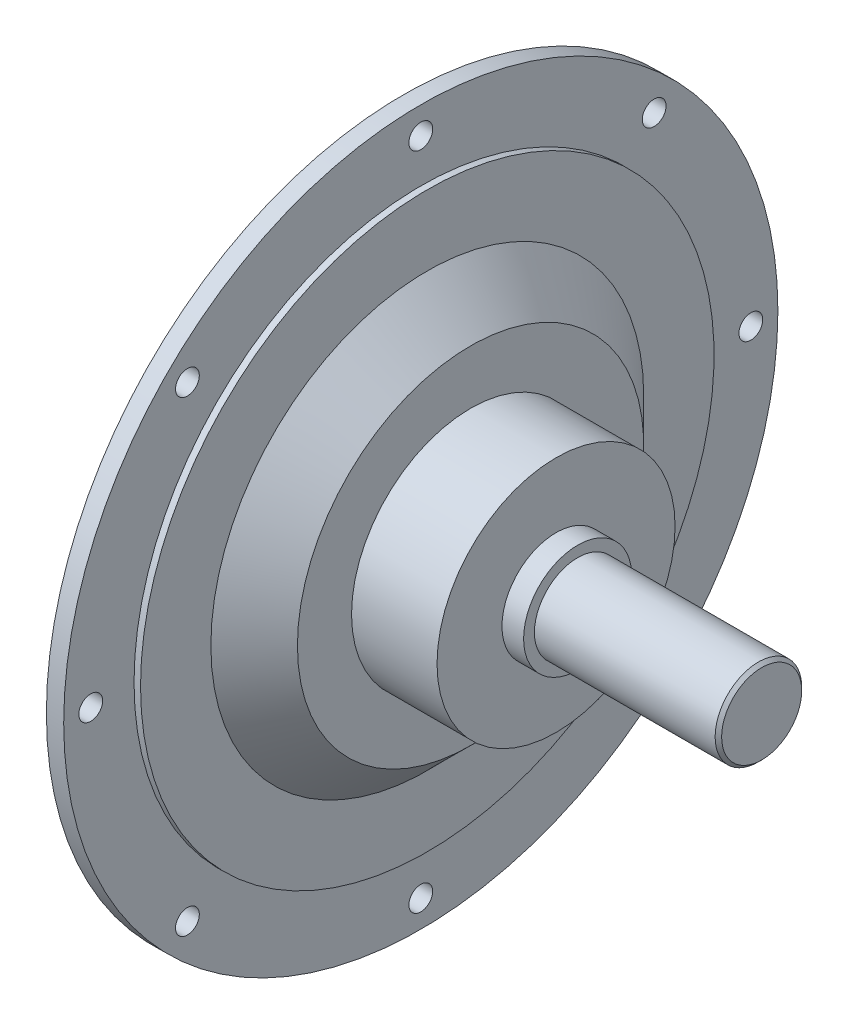
ISO-10303-21;
HEADER;
FILE_DESCRIPTION(('STEP AP214'),'2;1');
FILE_NAME('part.step','',(''),(''),'','','');
FILE_SCHEMA(('AUTOMOTIVE_DESIGN { 1 0 10303 214 1 1 1 1 }'));
ENDSEC;
DATA;
#1=APPLICATION_CONTEXT('core data for automotive mechanical design processes');
#2=APPLICATION_PROTOCOL_DEFINITION('international standard','automotive_design',2000,#1);
#3=PRODUCT_CONTEXT('',#1,'mechanical');
#4=PRODUCT('Part','Part','',(#3));
#5=PRODUCT_RELATED_PRODUCT_CATEGORY('part','',(#4));
#6=PRODUCT_DEFINITION_FORMATION('','',#4);
#7=PRODUCT_DEFINITION_CONTEXT('part definition',#1,'design');
#8=PRODUCT_DEFINITION('design','',#6,#7);
#9=PRODUCT_DEFINITION_SHAPE('','',#8);
#10=(LENGTH_UNIT() NAMED_UNIT(*) SI_UNIT(.MILLI.,.METRE.));
#11=(NAMED_UNIT(*) PLANE_ANGLE_UNIT() SI_UNIT($,.RADIAN.));
#12=(NAMED_UNIT(*) SI_UNIT($,.STERADIAN.) SOLID_ANGLE_UNIT());
#13=UNCERTAINTY_MEASURE_WITH_UNIT(LENGTH_MEASURE(1.E-05),#10,'distance_accuracy_value','');
#14=(GEOMETRIC_REPRESENTATION_CONTEXT(3) GLOBAL_UNCERTAINTY_ASSIGNED_CONTEXT((#13)) GLOBAL_UNIT_ASSIGNED_CONTEXT((#10,
#11,#12)) REPRESENTATION_CONTEXT('',''));
#15=CARTESIAN_POINT('',(0.,0.,0.));
#16=DIRECTION('',(0.,0.,1.));
#17=DIRECTION('',(1.,0.,0.));
#18=AXIS2_PLACEMENT_3D('',#15,#16,#17);
#19=CARTESIAN_POINT('',(0.,132.5,0.));
#20=DIRECTION('',(-1.,0.,0.));
#21=DIRECTION('',(0.,0.,1.));
#22=AXIS2_PLACEMENT_3D('',#19,#20,#21);
#23=PLANE('',#22);
#24=CARTESIAN_POINT('',(0.,107.83378413095,107.833784130947));
#25=DIRECTION('',(1.,0.,0.));
#26=DIRECTION('',(0.,0.,-1.));
#27=AXIS2_PLACEMENT_3D('',#24,#25,#26);
#28=CIRCLE('',#27,5.49999999999999);
#29=CARTESIAN_POINT('',(0.,107.83378413095,102.333784130947));
#30=VERTEX_POINT('',#29);
#31=EDGE_CURVE('E137',#30,#30,#28,.T.);
#32=ORIENTED_EDGE('',*,*,#31,.F.);
#33=EDGE_LOOP('',(#32));
#34=FACE_BOUND('',#33,.T.);
#35=CARTESIAN_POINT('',(0.,1.59735271252073E-12,152.5));
#36=DIRECTION('',(1.,0.,0.));
#37=DIRECTION('',(0.,0.,-1.));
#38=AXIS2_PLACEMENT_3D('',#35,#36,#37);
#39=CIRCLE('',#38,5.49999999999999);
#40=CARTESIAN_POINT('',(0.,1.59735271252073E-12,147.));
#41=VERTEX_POINT('',#40);
#42=EDGE_CURVE('E131',#41,#41,#39,.T.);
#43=ORIENTED_EDGE('',*,*,#42,.F.);
#44=EDGE_LOOP('',(#43));
#45=FACE_BOUND('',#44,.T.);
#46=CARTESIAN_POINT('',(0.,-107.833784130948,107.833784130949));
#47=DIRECTION('',(1.,0.,0.));
#48=DIRECTION('',(0.,0.,-1.));
#49=AXIS2_PLACEMENT_3D('',#46,#47,#48);
#50=CIRCLE('',#49,5.49999999999999);
#51=CARTESIAN_POINT('',(0.,-107.833784130948,102.333784130949));
#52=VERTEX_POINT('',#51);
#53=EDGE_CURVE('E125',#52,#52,#50,.T.);
#54=ORIENTED_EDGE('',*,*,#53,.F.);
#55=EDGE_LOOP('',(#54));
#56=FACE_BOUND('',#55,.T.);
#57=CARTESIAN_POINT('',(0.,-152.5,0.));
#58=DIRECTION('',(1.,0.,0.));
#59=DIRECTION('',(0.,0.,-1.));
#60=AXIS2_PLACEMENT_3D('',#57,#58,#59);
#61=CIRCLE('',#60,5.49999999999998);
#62=CARTESIAN_POINT('',(0.,-152.5,-5.49999999999998));
#63=VERTEX_POINT('',#62);
#64=EDGE_CURVE('E119',#63,#63,#61,.T.);
#65=ORIENTED_EDGE('',*,*,#64,.F.);
#66=EDGE_LOOP('',(#65));
#67=FACE_BOUND('',#66,.T.);
#68=CARTESIAN_POINT('',(0.,-107.833784130949,-107.833784130948));
#69=DIRECTION('',(1.,0.,0.));
#70=DIRECTION('',(0.,0.,-1.));
#71=AXIS2_PLACEMENT_3D('',#68,#69,#70);
#72=CIRCLE('',#71,5.49999999999999);
#73=CARTESIAN_POINT('',(0.,-107.833784130949,-113.333784130948));
#74=VERTEX_POINT('',#73);
#75=EDGE_CURVE('E113',#74,#74,#72,.T.);
#76=ORIENTED_EDGE('',*,*,#75,.F.);
#77=EDGE_LOOP('',(#76));
#78=FACE_BOUND('',#77,.T.);
#79=CARTESIAN_POINT('',(0.,-5.32450904173578E-13,-152.5));
#80=DIRECTION('',(1.,0.,0.));
#81=DIRECTION('',(0.,0.,-1.));
#82=AXIS2_PLACEMENT_3D('',#79,#80,#81);
#83=CIRCLE('',#82,5.49999999999999);
#84=CARTESIAN_POINT('',(0.,-5.32450904173578E-13,-158.));
#85=VERTEX_POINT('',#84);
#86=EDGE_CURVE('E107',#85,#85,#83,.T.);
#87=ORIENTED_EDGE('',*,*,#86,.F.);
#88=EDGE_LOOP('',(#87));
#89=FACE_BOUND('',#88,.T.);
#90=CARTESIAN_POINT('',(0.,107.833784130948,-107.833784130949));
#91=DIRECTION('',(1.,0.,0.));
#92=DIRECTION('',(0.,0.,-1.));
#93=AXIS2_PLACEMENT_3D('',#90,#91,#92);
#94=CIRCLE('',#93,5.49999999999999);
#95=CARTESIAN_POINT('',(0.,107.833784130948,-113.333784130949));
#96=VERTEX_POINT('',#95);
#97=EDGE_CURVE('E101',#96,#96,#94,.T.);
#98=ORIENTED_EDGE('',*,*,#97,.F.);
#99=EDGE_LOOP('',(#98));
#100=FACE_BOUND('',#99,.T.);
#101=CARTESIAN_POINT('',(0.,0.,0.));
#102=DIRECTION('',(-1.,0.,0.));
#103=DIRECTION('',(0.,0.,1.));
#104=AXIS2_PLACEMENT_3D('',#101,#102,#103);
#105=CIRCLE('',#104,132.5);
#106=CARTESIAN_POINT('',(0.,0.,132.5));
#107=VERTEX_POINT('',#106);
#108=EDGE_CURVE('E89',#107,#107,#105,.T.);
#109=ORIENTED_EDGE('',*,*,#108,.T.);
#110=EDGE_LOOP('',(#109));
#111=FACE_BOUND('',#110,.T.);
#112=CARTESIAN_POINT('',(0.,0.,0.));
#113=DIRECTION('',(-1.,0.,0.));
#114=DIRECTION('',(0.,0.,1.));
#115=AXIS2_PLACEMENT_3D('',#112,#113,#114);
#116=CIRCLE('',#115,165.);
#117=CARTESIAN_POINT('',(0.,0.,165.));
#118=VERTEX_POINT('',#117);
#119=EDGE_CURVE('E86',#118,#118,#116,.T.);
#120=ORIENTED_EDGE('',*,*,#119,.F.);
#121=EDGE_LOOP('',(#120));
#122=FACE_BOUND('',#121,.T.);
#123=CARTESIAN_POINT('',(0.,152.5,0.));
#124=DIRECTION('',(1.,0.,0.));
#125=DIRECTION('',(0.,0.,-1.));
#126=AXIS2_PLACEMENT_3D('',#123,#124,#125);
#127=CIRCLE('',#126,5.49999999999998);
#128=CARTESIAN_POINT('',(0.,152.5,-5.49999999999998));
#129=VERTEX_POINT('',#128);
#130=EDGE_CURVE('E95',#129,#129,#127,.T.);
#131=ORIENTED_EDGE('',*,*,#130,.F.);
#132=EDGE_LOOP('',(#131));
#133=FACE_BOUND('',#132,.T.);
#134=ADVANCED_FACE('F33',(#34,#45,#56,#67,#78,#89,#100,#111,#122,#133),#23,.F.);
#135=CARTESIAN_POINT('',(-57.6549737634885,0.,0.));
#136=DIRECTION('',(-1.,0.,0.));
#137=DIRECTION('',(0.,0.,1.));
#138=AXIS2_PLACEMENT_3D('',#135,#136,#137);
#139=CYLINDRICAL_SURFACE('',#138,132.5);
#140=ORIENTED_EDGE('',*,*,#108,.F.);
#141=EDGE_LOOP('',(#140));
#142=FACE_BOUND('',#141,.T.);
#143=CARTESIAN_POINT('',(3.,0.,0.));
#144=DIRECTION('',(-1.,0.,0.));
#145=DIRECTION('',(0.,0.,1.));
#146=AXIS2_PLACEMENT_3D('',#143,#144,#145);
#147=CIRCLE('',#146,132.5);
#148=CARTESIAN_POINT('',(3.,0.,132.5));
#149=VERTEX_POINT('',#148);
#150=EDGE_CURVE('E44',#149,#149,#147,.T.);
#151=ORIENTED_EDGE('',*,*,#150,.T.);
#152=EDGE_LOOP('',(#151));
#153=FACE_BOUND('',#152,.T.);
#154=ADVANCED_FACE('F145',(#142,#153),#139,.T.);
#155=CARTESIAN_POINT('',(3.,132.5,0.));
#156=DIRECTION('',(-1.,0.,0.));
#157=DIRECTION('',(0.,0.,1.));
#158=AXIS2_PLACEMENT_3D('',#155,#156,#157);
#159=PLANE('',#158);
#160=ORIENTED_EDGE('',*,*,#150,.F.);
#161=EDGE_LOOP('',(#160));
#162=FACE_BOUND('',#161,.T.);
#163=CARTESIAN_POINT('',(3.,0.,0.));
#164=DIRECTION('',(-1.,0.,0.));
#165=DIRECTION('',(0.,0.,1.));
#166=AXIS2_PLACEMENT_3D('',#163,#164,#165);
#167=CIRCLE('',#166,99.9999999999999);
#168=CARTESIAN_POINT('',(3.,0.,99.9999999999999));
#169=VERTEX_POINT('',#168);
#170=EDGE_CURVE('E48',#169,#169,#167,.T.);
#171=ORIENTED_EDGE('',*,*,#170,.T.);
#172=EDGE_LOOP('',(#171));
#173=FACE_BOUND('',#172,.T.);
#174=ADVANCED_FACE('F234',(#162,#173),#159,.F.);
#175=CARTESIAN_POINT('',(23.,0.,0.));
#176=DIRECTION('',(-1.,0.,0.));
#177=DIRECTION('',(0.,0.,1.));
#178=AXIS2_PLACEMENT_3D('',#175,#176,#177);
#179=CONICAL_SURFACE('',#178,80.,0.785398163397446);
#180=ORIENTED_EDGE('',*,*,#170,.F.);
#181=EDGE_LOOP('',(#180));
#182=FACE_BOUND('',#181,.T.);
#183=CARTESIAN_POINT('',(23.,0.,0.));
#184=DIRECTION('',(-1.,0.,0.));
#185=DIRECTION('',(0.,0.,1.));
#186=AXIS2_PLACEMENT_3D('',#183,#184,#185);
#187=CIRCLE('',#186,80.);
#188=CARTESIAN_POINT('',(23.,0.,80.));
#189=VERTEX_POINT('',#188);
#190=EDGE_CURVE('E53',#189,#189,#187,.T.);
#191=ORIENTED_EDGE('',*,*,#190,.T.);
#192=EDGE_LOOP('',(#191));
#193=FACE_BOUND('',#192,.T.);
#194=ADVANCED_FACE('F230',(#182,#193),#179,.T.);
#195=CARTESIAN_POINT('',(23.,80.,0.));
#196=DIRECTION('',(-1.,0.,0.));
#197=DIRECTION('',(0.,0.,1.));
#198=AXIS2_PLACEMENT_3D('',#195,#196,#197);
#199=PLANE('',#198);
#200=ORIENTED_EDGE('',*,*,#190,.F.);
#201=EDGE_LOOP('',(#200));
#202=FACE_BOUND('',#201,.T.);
#203=CARTESIAN_POINT('',(23.,0.,0.));
#204=DIRECTION('',(-1.,0.,0.));
#205=DIRECTION('',(0.,0.,1.));
#206=AXIS2_PLACEMENT_3D('',#203,#204,#205);
#207=CIRCLE('',#206,55.);
#208=CARTESIAN_POINT('',(23.,0.,55.));
#209=VERTEX_POINT('',#208);
#210=EDGE_CURVE('E56',#209,#209,#207,.T.);
#211=ORIENTED_EDGE('',*,*,#210,.T.);
#212=EDGE_LOOP('',(#211));
#213=FACE_BOUND('',#212,.T.);
#214=ADVANCED_FACE('F226',(#202,#213),#199,.F.);
#215=CARTESIAN_POINT('',(-57.6549737634885,0.,0.));
#216=DIRECTION('',(-1.,0.,0.));
#217=DIRECTION('',(0.,0.,1.));
#218=AXIS2_PLACEMENT_3D('',#215,#216,#217);
#219=CYLINDRICAL_SURFACE('',#218,55.);
#220=ORIENTED_EDGE('',*,*,#210,.F.);
#221=EDGE_LOOP('',(#220));
#222=FACE_BOUND('',#221,.T.);
#223=CARTESIAN_POINT('',(62.5,0.,0.));
#224=DIRECTION('',(-1.,0.,0.));
#225=DIRECTION('',(0.,0.,1.));
#226=AXIS2_PLACEMENT_3D('',#223,#224,#225);
#227=CIRCLE('',#226,55.);
#228=CARTESIAN_POINT('',(62.5,0.,55.));
#229=VERTEX_POINT('',#228);
#230=EDGE_CURVE('E59',#229,#229,#227,.T.);
#231=ORIENTED_EDGE('',*,*,#230,.T.);
#232=EDGE_LOOP('',(#231));
#233=FACE_BOUND('',#232,.T.);
#234=ADVANCED_FACE('F222',(#222,#233),#219,.T.);
#235=CARTESIAN_POINT('',(62.5,55.,0.));
#236=DIRECTION('',(-1.,0.,0.));
#237=DIRECTION('',(0.,0.,1.));
#238=AXIS2_PLACEMENT_3D('',#235,#236,#237);
#239=PLANE('',#238);
#240=ORIENTED_EDGE('',*,*,#230,.F.);
#241=EDGE_LOOP('',(#240));
#242=FACE_BOUND('',#241,.T.);
#243=CARTESIAN_POINT('',(62.5,0.,0.));
#244=DIRECTION('',(-1.,0.,0.));
#245=DIRECTION('',(0.,0.,1.));
#246=AXIS2_PLACEMENT_3D('',#243,#244,#245);
#247=CIRCLE('',#246,25.);
#248=CARTESIAN_POINT('',(62.5,0.,25.));
#249=VERTEX_POINT('',#248);
#250=EDGE_CURVE('E62',#249,#249,#247,.T.);
#251=ORIENTED_EDGE('',*,*,#250,.T.);
#252=EDGE_LOOP('',(#251));
#253=FACE_BOUND('',#252,.T.);
#254=ADVANCED_FACE('F218',(#242,#253),#239,.F.);
#255=CARTESIAN_POINT('',(-57.6549737634885,0.,0.));
#256=DIRECTION('',(-1.,0.,0.));
#257=DIRECTION('',(0.,0.,1.));
#258=AXIS2_PLACEMENT_3D('',#255,#256,#257);
#259=CYLINDRICAL_SURFACE('',#258,25.);
#260=ORIENTED_EDGE('',*,*,#250,.F.);
#261=EDGE_LOOP('',(#260));
#262=FACE_BOUND('',#261,.T.);
#263=CARTESIAN_POINT('',(72.5,0.,0.));
#264=DIRECTION('',(-1.,0.,0.));
#265=DIRECTION('',(0.,0.,1.));
#266=AXIS2_PLACEMENT_3D('',#263,#264,#265);
#267=CIRCLE('',#266,25.);
#268=CARTESIAN_POINT('',(72.5,0.,25.));
#269=VERTEX_POINT('',#268);
#270=EDGE_CURVE('E65',#269,#269,#267,.T.);
#271=ORIENTED_EDGE('',*,*,#270,.T.);
#272=EDGE_LOOP('',(#271));
#273=FACE_BOUND('',#272,.T.);
#274=ADVANCED_FACE('F214',(#262,#273),#259,.T.);
#275=CARTESIAN_POINT('',(72.5,25.,0.));
#276=DIRECTION('',(-1.,0.,0.));
#277=DIRECTION('',(0.,0.,1.));
#278=AXIS2_PLACEMENT_3D('',#275,#276,#277);
#279=PLANE('',#278);
#280=ORIENTED_EDGE('',*,*,#270,.F.);
#281=EDGE_LOOP('',(#280));
#282=FACE_BOUND('',#281,.T.);
#283=CARTESIAN_POINT('',(72.5,0.,0.));
#284=DIRECTION('',(-1.,0.,0.));
#285=DIRECTION('',(0.,0.,1.));
#286=AXIS2_PLACEMENT_3D('',#283,#284,#285);
#287=CIRCLE('',#286,20.);
#288=CARTESIAN_POINT('',(72.5,0.,20.));
#289=VERTEX_POINT('',#288);
#290=EDGE_CURVE('E68',#289,#289,#287,.T.);
#291=ORIENTED_EDGE('',*,*,#290,.T.);
#292=EDGE_LOOP('',(#291));
#293=FACE_BOUND('',#292,.T.);
#294=ADVANCED_FACE('F211',(#282,#293),#279,.F.);
#295=CARTESIAN_POINT('',(-57.6549737634885,0.,0.));
#296=DIRECTION('',(-1.,0.,0.));
#297=DIRECTION('',(0.,0.,1.));
#298=AXIS2_PLACEMENT_3D('',#295,#296,#297);
#299=CYLINDRICAL_SURFACE('',#298,20.);
#300=CARTESIAN_POINT('',(156.,0.,0.));
#301=DIRECTION('',(-1.,0.,0.));
#302=DIRECTION('',(0.,0.,1.));
#303=AXIS2_PLACEMENT_3D('',#300,#301,#302);
#304=CIRCLE('',#303,20.);
#305=CARTESIAN_POINT('',(156.,0.,20.));
#306=VERTEX_POINT('',#305);
#307=EDGE_CURVE('E40',#306,#306,#304,.T.);
#308=ORIENTED_EDGE('',*,*,#307,.T.);
#309=EDGE_LOOP('',(#308));
#310=FACE_BOUND('',#309,.T.);
#311=ORIENTED_EDGE('',*,*,#290,.F.);
#312=EDGE_LOOP('',(#311));
#313=FACE_BOUND('',#312,.T.);
#314=ADVANCED_FACE('F208',(#310,#313),#299,.T.);
#315=CARTESIAN_POINT('',(157.5,20.,0.));
#316=DIRECTION('',(-1.,0.,0.));
#317=DIRECTION('',(0.,0.,1.));
#318=AXIS2_PLACEMENT_3D('',#315,#316,#317);
#319=PLANE('',#318);
#320=CARTESIAN_POINT('',(157.5,0.,0.));
#321=DIRECTION('',(-1.,0.,0.));
#322=DIRECTION('',(0.,0.,1.));
#323=AXIS2_PLACEMENT_3D('',#320,#321,#322);
#324=CIRCLE('',#323,18.5);
#325=CARTESIAN_POINT('',(157.5,0.,18.5));
#326=VERTEX_POINT('',#325);
#327=EDGE_CURVE('E10',#326,#326,#324,.F.);
#328=ORIENTED_EDGE('',*,*,#327,.T.);
#329=EDGE_LOOP('',(#328));
#330=FACE_BOUND('',#329,.T.);
#331=ADVANCED_FACE('F204',(#330),#319,.F.);
#332=CARTESIAN_POINT('',(-40.,0.,0.));
#333=DIRECTION('',(1.,0.,0.));
#334=DIRECTION('',(0.,0.,-1.));
#335=AXIS2_PLACEMENT_3D('',#332,#333,#334);
#336=PLANE('',#335);
#337=CARTESIAN_POINT('',(-40.,0.,0.));
#338=DIRECTION('',(-1.,0.,0.));
#339=DIRECTION('',(0.,0.,1.));
#340=AXIS2_PLACEMENT_3D('',#337,#338,#339);
#341=CIRCLE('',#340,55.);
#342=CARTESIAN_POINT('',(-40.,0.,55.));
#343=VERTEX_POINT('',#342);
#344=EDGE_CURVE('E71',#343,#343,#341,.T.);
#345=ORIENTED_EDGE('',*,*,#344,.T.);
#346=EDGE_LOOP('',(#345));
#347=FACE_BOUND('',#346,.T.);
#348=ADVANCED_FACE('F200',(#347),#336,.F.);
#349=CARTESIAN_POINT('',(12.,0.,0.));
#350=DIRECTION('',(1.,0.,0.));
#351=DIRECTION('',(0.,0.,-1.));
#352=AXIS2_PLACEMENT_3D('',#349,#350,#351);
#353=CONICAL_SURFACE('',#352,68.9333580064182,0.261799387799146);
#354=ORIENTED_EDGE('',*,*,#344,.F.);
#355=EDGE_LOOP('',(#354));
#356=FACE_BOUND('',#355,.T.);
#357=CARTESIAN_POINT('',(12.,0.,0.));
#358=DIRECTION('',(-1.,0.,0.));
#359=DIRECTION('',(0.,0.,1.));
#360=AXIS2_PLACEMENT_3D('',#357,#358,#359);
#361=CIRCLE('',#360,68.9333580064182);
#362=CARTESIAN_POINT('',(12.,0.,68.9333580064182));
#363=VERTEX_POINT('',#362);
#364=EDGE_CURVE('E74',#363,#363,#361,.T.);
#365=ORIENTED_EDGE('',*,*,#364,.T.);
#366=EDGE_LOOP('',(#365));
#367=FACE_BOUND('',#366,.T.);
#368=ADVANCED_FACE('F196',(#356,#367),#353,.T.);
#369=CARTESIAN_POINT('',(12.,75.443650813896,0.));
#370=DIRECTION('',(1.,0.,0.));
#371=DIRECTION('',(0.,0.,-1.));
#372=AXIS2_PLACEMENT_3D('',#369,#370,#371);
#373=PLANE('',#372);
#374=ORIENTED_EDGE('',*,*,#364,.F.);
#375=EDGE_LOOP('',(#374));
#376=FACE_BOUND('',#375,.T.);
#377=CARTESIAN_POINT('',(12.,0.,0.));
#378=DIRECTION('',(-1.,0.,0.));
#379=DIRECTION('',(0.,0.,1.));
#380=AXIS2_PLACEMENT_3D('',#377,#378,#379);
#381=CIRCLE('',#380,75.443650813896);
#382=CARTESIAN_POINT('',(12.,0.,75.443650813896));
#383=VERTEX_POINT('',#382);
#384=EDGE_CURVE('E77',#383,#383,#381,.T.);
#385=ORIENTED_EDGE('',*,*,#384,.T.);
#386=EDGE_LOOP('',(#385));
#387=FACE_BOUND('',#386,.T.);
#388=ADVANCED_FACE('F192',(#376,#387),#373,.F.);
#389=CARTESIAN_POINT('',(-7.99999999999999,0.,0.));
#390=DIRECTION('',(-1.,0.,0.));
#391=DIRECTION('',(0.,0.,1.));
#392=AXIS2_PLACEMENT_3D('',#389,#390,#391);
#393=CONICAL_SURFACE('',#392,95.4436508138959,0.785398163397446);
#394=ORIENTED_EDGE('',*,*,#384,.F.);
#395=EDGE_LOOP('',(#394));
#396=FACE_BOUND('',#395,.T.);
#397=CARTESIAN_POINT('',(-7.99999999999999,0.,0.));
#398=DIRECTION('',(-1.,0.,0.));
#399=DIRECTION('',(0.,0.,1.));
#400=AXIS2_PLACEMENT_3D('',#397,#398,#399);
#401=CIRCLE('',#400,95.4436508138959);
#402=CARTESIAN_POINT('',(-7.99999999999999,0.,95.4436508138959));
#403=VERTEX_POINT('',#402);
#404=EDGE_CURVE('E80',#403,#403,#401,.T.);
#405=ORIENTED_EDGE('',*,*,#404,.T.);
#406=EDGE_LOOP('',(#405));
#407=FACE_BOUND('',#406,.T.);
#408=ADVANCED_FACE('F188',(#396,#407),#393,.F.);
#409=CARTESIAN_POINT('',(-8.,165.,0.));
#410=DIRECTION('',(1.,0.,0.));
#411=DIRECTION('',(0.,0.,-1.));
#412=AXIS2_PLACEMENT_3D('',#409,#410,#411);
#413=PLANE('',#412);
#414=CARTESIAN_POINT('',(-8.,107.83378413095,107.833784130947));
#415=DIRECTION('',(1.,0.,0.));
#416=DIRECTION('',(0.,0.,-1.));
#417=AXIS2_PLACEMENT_3D('',#414,#415,#416);
#418=CIRCLE('',#417,5.49999999999999);
#419=CARTESIAN_POINT('',(-8.,107.83378413095,102.333784130947));
#420=VERTEX_POINT('',#419);
#421=EDGE_CURVE('E134',#420,#420,#418,.T.);
#422=ORIENTED_EDGE('',*,*,#421,.T.);
#423=EDGE_LOOP('',(#422));
#424=FACE_BOUND('',#423,.T.);
#425=CARTESIAN_POINT('',(-8.,1.59735271252073E-12,152.5));
#426=DIRECTION('',(1.,0.,0.));
#427=DIRECTION('',(0.,0.,-1.));
#428=AXIS2_PLACEMENT_3D('',#425,#426,#427);
#429=CIRCLE('',#428,5.49999999999999);
#430=CARTESIAN_POINT('',(-8.,1.59735271252073E-12,147.));
#431=VERTEX_POINT('',#430);
#432=EDGE_CURVE('E128',#431,#431,#429,.T.);
#433=ORIENTED_EDGE('',*,*,#432,.T.);
#434=EDGE_LOOP('',(#433));
#435=FACE_BOUND('',#434,.T.);
#436=CARTESIAN_POINT('',(-8.,-107.833784130948,107.833784130949));
#437=DIRECTION('',(1.,0.,0.));
#438=DIRECTION('',(0.,0.,-1.));
#439=AXIS2_PLACEMENT_3D('',#436,#437,#438);
#440=CIRCLE('',#439,5.49999999999999);
#441=CARTESIAN_POINT('',(-8.,-107.833784130948,102.333784130949));
#442=VERTEX_POINT('',#441);
#443=EDGE_CURVE('E122',#442,#442,#440,.T.);
#444=ORIENTED_EDGE('',*,*,#443,.T.);
#445=EDGE_LOOP('',(#444));
#446=FACE_BOUND('',#445,.T.);
#447=CARTESIAN_POINT('',(-8.,-152.5,0.));
#448=DIRECTION('',(1.,0.,0.));
#449=DIRECTION('',(0.,0.,-1.));
#450=AXIS2_PLACEMENT_3D('',#447,#448,#449);
#451=CIRCLE('',#450,5.49999999999999);
#452=CARTESIAN_POINT('',(-8.,-152.5,-5.49999999999999));
#453=VERTEX_POINT('',#452);
#454=EDGE_CURVE('E116',#453,#453,#451,.T.);
#455=ORIENTED_EDGE('',*,*,#454,.T.);
#456=EDGE_LOOP('',(#455));
#457=FACE_BOUND('',#456,.T.);
#458=CARTESIAN_POINT('',(-8.,-107.833784130949,-107.833784130948));
#459=DIRECTION('',(1.,0.,0.));
#460=DIRECTION('',(0.,0.,-1.));
#461=AXIS2_PLACEMENT_3D('',#458,#459,#460);
#462=CIRCLE('',#461,5.49999999999999);
#463=CARTESIAN_POINT('',(-8.,-107.833784130949,-113.333784130948));
#464=VERTEX_POINT('',#463);
#465=EDGE_CURVE('E110',#464,#464,#462,.T.);
#466=ORIENTED_EDGE('',*,*,#465,.T.);
#467=EDGE_LOOP('',(#466));
#468=FACE_BOUND('',#467,.T.);
#469=CARTESIAN_POINT('',(-8.,-5.32450904173578E-13,-152.5));
#470=DIRECTION('',(1.,0.,0.));
#471=DIRECTION('',(0.,0.,-1.));
#472=AXIS2_PLACEMENT_3D('',#469,#470,#471);
#473=CIRCLE('',#472,5.49999999999999);
#474=CARTESIAN_POINT('',(-8.,-5.32450904173578E-13,-158.));
#475=VERTEX_POINT('',#474);
#476=EDGE_CURVE('E104',#475,#475,#473,.T.);
#477=ORIENTED_EDGE('',*,*,#476,.T.);
#478=EDGE_LOOP('',(#477));
#479=FACE_BOUND('',#478,.T.);
#480=CARTESIAN_POINT('',(-8.,107.833784130948,-107.833784130949));
#481=DIRECTION('',(1.,0.,0.));
#482=DIRECTION('',(0.,0.,-1.));
#483=AXIS2_PLACEMENT_3D('',#480,#481,#482);
#484=CIRCLE('',#483,5.49999999999999);
#485=CARTESIAN_POINT('',(-8.,107.833784130948,-113.333784130949));
#486=VERTEX_POINT('',#485);
#487=EDGE_CURVE('E98',#486,#486,#484,.T.);
#488=ORIENTED_EDGE('',*,*,#487,.T.);
#489=EDGE_LOOP('',(#488));
#490=FACE_BOUND('',#489,.T.);
#491=CARTESIAN_POINT('',(-8.,152.5,0.));
#492=DIRECTION('',(1.,0.,0.));
#493=DIRECTION('',(0.,0.,-1.));
#494=AXIS2_PLACEMENT_3D('',#491,#492,#493);
#495=CIRCLE('',#494,5.49999999999999);
#496=CARTESIAN_POINT('',(-8.,152.5,-5.49999999999999));
#497=VERTEX_POINT('',#496);
#498=EDGE_CURVE('E92',#497,#497,#495,.T.);
#499=ORIENTED_EDGE('',*,*,#498,.T.);
#500=EDGE_LOOP('',(#499));
#501=FACE_BOUND('',#500,.T.);
#502=ORIENTED_EDGE('',*,*,#404,.F.);
#503=EDGE_LOOP('',(#502));
#504=FACE_BOUND('',#503,.T.);
#505=CARTESIAN_POINT('',(-8.,0.,0.));
#506=DIRECTION('',(-1.,0.,0.));
#507=DIRECTION('',(0.,0.,1.));
#508=AXIS2_PLACEMENT_3D('',#505,#506,#507);
#509=CIRCLE('',#508,165.);
#510=CARTESIAN_POINT('',(-8.,0.,165.));
#511=VERTEX_POINT('',#510);
#512=EDGE_CURVE('E83',#511,#511,#509,.T.);
#513=ORIENTED_EDGE('',*,*,#512,.T.);
#514=EDGE_LOOP('',(#513));
#515=FACE_BOUND('',#514,.T.);
#516=ADVANCED_FACE('F184',(#424,#435,#446,#457,#468,#479,#490,#501,#504,#515),#413,.F.);
#517=CARTESIAN_POINT('',(-57.6549737634885,0.,0.));
#518=DIRECTION('',(-1.,0.,0.));
#519=DIRECTION('',(0.,0.,1.));
#520=AXIS2_PLACEMENT_3D('',#517,#518,#519);
#521=CYLINDRICAL_SURFACE('',#520,165.);
#522=ORIENTED_EDGE('',*,*,#512,.F.);
#523=EDGE_LOOP('',(#522));
#524=FACE_BOUND('',#523,.T.);
#525=ORIENTED_EDGE('',*,*,#119,.T.);
#526=EDGE_LOOP('',(#525));
#527=FACE_BOUND('',#526,.T.);
#528=ADVANCED_FACE('F177',(#524,#527),#521,.T.);
#529=CARTESIAN_POINT('',(156.,0.,0.));
#530=DIRECTION('',(-1.,0.,0.));
#531=DIRECTION('',(0.,0.,1.));
#532=AXIS2_PLACEMENT_3D('',#529,#530,#531);
#533=CONICAL_SURFACE('',#532,20.,0.785398163397443);
#534=ORIENTED_EDGE('',*,*,#327,.F.);
#535=EDGE_LOOP('',(#534));
#536=FACE_BOUND('',#535,.T.);
#537=ORIENTED_EDGE('',*,*,#307,.F.);
#538=EDGE_LOOP('',(#537));
#539=FACE_BOUND('',#538,.T.);
#540=ADVANCED_FACE('F35',(#536,#539),#533,.T.);
#541=CARTESIAN_POINT('',(0.,152.5,0.));
#542=DIRECTION('',(1.,0.,0.));
#543=DIRECTION('',(0.,0.,-1.));
#544=AXIS2_PLACEMENT_3D('',#541,#542,#543);
#545=CYLINDRICAL_SURFACE('',#544,5.49999999999999);
#546=ORIENTED_EDGE('',*,*,#498,.F.);
#547=EDGE_LOOP('',(#546));
#548=FACE_BOUND('',#547,.T.);
#549=ORIENTED_EDGE('',*,*,#130,.T.);
#550=EDGE_LOOP('',(#549));
#551=FACE_BOUND('',#550,.T.);
#552=ADVANCED_FACE('F165',(#548,#551),#545,.F.);
#553=CARTESIAN_POINT('',(0.,107.833784130948,-107.833784130949));
#554=DIRECTION('',(1.,0.,0.));
#555=DIRECTION('',(0.,0.,-1.));
#556=AXIS2_PLACEMENT_3D('',#553,#554,#555);
#557=CYLINDRICAL_SURFACE('',#556,5.49999999999999);
#558=ORIENTED_EDGE('',*,*,#487,.F.);
#559=EDGE_LOOP('',(#558));
#560=FACE_BOUND('',#559,.T.);
#561=ORIENTED_EDGE('',*,*,#97,.T.);
#562=EDGE_LOOP('',(#561));
#563=FACE_BOUND('',#562,.T.);
#564=ADVANCED_FACE('F167',(#560,#563),#557,.F.);
#565=CARTESIAN_POINT('',(0.,-5.32450904173578E-13,-152.5));
#566=DIRECTION('',(1.,0.,0.));
#567=DIRECTION('',(0.,0.,-1.));
#568=AXIS2_PLACEMENT_3D('',#565,#566,#567);
#569=CYLINDRICAL_SURFACE('',#568,5.49999999999999);
#570=ORIENTED_EDGE('',*,*,#476,.F.);
#571=EDGE_LOOP('',(#570));
#572=FACE_BOUND('',#571,.T.);
#573=ORIENTED_EDGE('',*,*,#86,.T.);
#574=EDGE_LOOP('',(#573));
#575=FACE_BOUND('',#574,.T.);
#576=ADVANCED_FACE('F174',(#572,#575),#569,.F.);
#577=CARTESIAN_POINT('',(0.,-107.833784130949,-107.833784130948));
#578=DIRECTION('',(1.,0.,0.));
#579=DIRECTION('',(0.,0.,-1.));
#580=AXIS2_PLACEMENT_3D('',#577,#578,#579);
#581=CYLINDRICAL_SURFACE('',#580,5.49999999999999);
#582=ORIENTED_EDGE('',*,*,#465,.F.);
#583=EDGE_LOOP('',(#582));
#584=FACE_BOUND('',#583,.T.);
#585=ORIENTED_EDGE('',*,*,#75,.T.);
#586=EDGE_LOOP('',(#585));
#587=FACE_BOUND('',#586,.T.);
#588=ADVANCED_FACE('F348',(#584,#587),#581,.F.);
#589=CARTESIAN_POINT('',(0.,-152.5,0.));
#590=DIRECTION('',(1.,0.,0.));
#591=DIRECTION('',(0.,0.,-1.));
#592=AXIS2_PLACEMENT_3D('',#589,#590,#591);
#593=CYLINDRICAL_SURFACE('',#592,5.49999999999999);
#594=ORIENTED_EDGE('',*,*,#454,.F.);
#595=EDGE_LOOP('',(#594));
#596=FACE_BOUND('',#595,.T.);
#597=ORIENTED_EDGE('',*,*,#64,.T.);
#598=EDGE_LOOP('',(#597));
#599=FACE_BOUND('',#598,.T.);
#600=ADVANCED_FACE('F356',(#596,#599),#593,.F.);
#601=CARTESIAN_POINT('',(0.,-107.833784130948,107.833784130949));
#602=DIRECTION('',(1.,0.,0.));
#603=DIRECTION('',(0.,0.,-1.));
#604=AXIS2_PLACEMENT_3D('',#601,#602,#603);
#605=CYLINDRICAL_SURFACE('',#604,5.49999999999999);
#606=ORIENTED_EDGE('',*,*,#443,.F.);
#607=EDGE_LOOP('',(#606));
#608=FACE_BOUND('',#607,.T.);
#609=ORIENTED_EDGE('',*,*,#53,.T.);
#610=EDGE_LOOP('',(#609));
#611=FACE_BOUND('',#610,.T.);
#612=ADVANCED_FACE('F365',(#608,#611),#605,.F.);
#613=CARTESIAN_POINT('',(0.,1.59735271252073E-12,152.5));
#614=DIRECTION('',(1.,0.,0.));
#615=DIRECTION('',(0.,0.,-1.));
#616=AXIS2_PLACEMENT_3D('',#613,#614,#615);
#617=CYLINDRICAL_SURFACE('',#616,5.49999999999999);
#618=ORIENTED_EDGE('',*,*,#432,.F.);
#619=EDGE_LOOP('',(#618));
#620=FACE_BOUND('',#619,.T.);
#621=ORIENTED_EDGE('',*,*,#42,.T.);
#622=EDGE_LOOP('',(#621));
#623=FACE_BOUND('',#622,.T.);
#624=ADVANCED_FACE('F374',(#620,#623),#617,.F.);
#625=CARTESIAN_POINT('',(0.,107.83378413095,107.833784130947));
#626=DIRECTION('',(1.,0.,0.));
#627=DIRECTION('',(0.,0.,-1.));
#628=AXIS2_PLACEMENT_3D('',#625,#626,#627);
#629=CYLINDRICAL_SURFACE('',#628,5.49999999999999);
#630=ORIENTED_EDGE('',*,*,#421,.F.);
#631=EDGE_LOOP('',(#630));
#632=FACE_BOUND('',#631,.T.);
#633=ORIENTED_EDGE('',*,*,#31,.T.);
#634=EDGE_LOOP('',(#633));
#635=FACE_BOUND('',#634,.T.);
#636=ADVANCED_FACE('F141',(#632,#635),#629,.F.);
#637=CLOSED_SHELL('',(#134,#154,#174,#194,#214,#234,#254,#274,#294,#314,#331,#348,#368,#388,
#408,#516,#528,#540,#552,#564,#576,#588,#600,#612,#624,#636));
#638=MANIFOLD_SOLID_BREP('B2',#637);
#639=ADVANCED_BREP_SHAPE_REPRESENTATION('',(#18,#638),#14);
#640=SHAPE_DEFINITION_REPRESENTATION(#9,#639);
ENDSEC;
END-ISO-10303-21;
